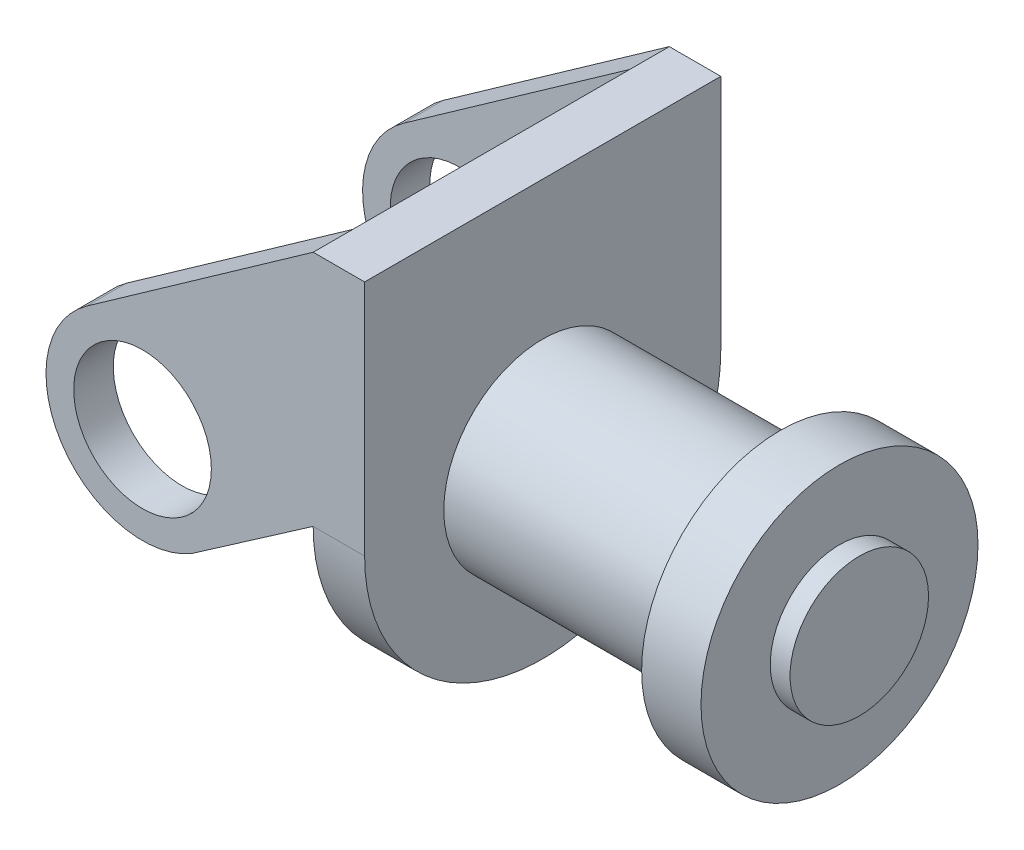
ISO-10303-21;
HEADER;
FILE_DESCRIPTION(('STEP AP214'),'2;1');
FILE_NAME('part.step','',(''),(''),'','','');
FILE_SCHEMA(('AUTOMOTIVE_DESIGN { 1 0 10303 214 1 1 1 1 }'));
ENDSEC;
DATA;
#1=APPLICATION_CONTEXT('core data for automotive mechanical design processes');
#2=APPLICATION_PROTOCOL_DEFINITION('international standard','automotive_design',2000,#1);
#3=PRODUCT_CONTEXT('',#1,'mechanical');
#4=PRODUCT('Part','Part','',(#3));
#5=PRODUCT_RELATED_PRODUCT_CATEGORY('part','',(#4));
#6=PRODUCT_DEFINITION_FORMATION('','',#4);
#7=PRODUCT_DEFINITION_CONTEXT('part definition',#1,'design');
#8=PRODUCT_DEFINITION('design','',#6,#7);
#9=PRODUCT_DEFINITION_SHAPE('','',#8);
#10=(LENGTH_UNIT() NAMED_UNIT(*) SI_UNIT(.MILLI.,.METRE.));
#11=(NAMED_UNIT(*) PLANE_ANGLE_UNIT() SI_UNIT($,.RADIAN.));
#12=(NAMED_UNIT(*) SI_UNIT($,.STERADIAN.) SOLID_ANGLE_UNIT());
#13=UNCERTAINTY_MEASURE_WITH_UNIT(LENGTH_MEASURE(1.E-05),#10,'distance_accuracy_value','');
#14=(GEOMETRIC_REPRESENTATION_CONTEXT(3) GLOBAL_UNCERTAINTY_ASSIGNED_CONTEXT((#13)) GLOBAL_UNIT_ASSIGNED_CONTEXT((#10,
#11,#12)) REPRESENTATION_CONTEXT('',''));
#15=CARTESIAN_POINT('',(0.,0.,0.));
#16=DIRECTION('',(0.,0.,1.));
#17=DIRECTION('',(1.,0.,0.));
#18=AXIS2_PLACEMENT_3D('',#15,#16,#17);
#19=CARTESIAN_POINT('',(0.,-0.06,0.));
#20=DIRECTION('',(1.,0.,0.));
#21=DIRECTION('',(0.,0.,-1.));
#22=AXIS2_PLACEMENT_3D('',#19,#20,#21);
#23=PLANE('',#22);
#24=DIRECTION('',(0.,0.,1.));
#25=VECTOR('',#24,1.);
#26=CARTESIAN_POINT('',(0.,-0.06,0.035));
#27=LINE('',#26,#25);
#28=CARTESIAN_POINT('',(0.,-0.06,0.035));
#29=VERTEX_POINT('',#28);
#30=CARTESIAN_POINT('',(0.,-0.06,0.045));
#31=VERTEX_POINT('',#30);
#32=EDGE_CURVE('E153',#29,#31,#27,.T.);
#33=ORIENTED_EDGE('',*,*,#32,.F.);
#34=DIRECTION('',(0.,1.,0.));
#35=VECTOR('',#34,1.);
#36=CARTESIAN_POINT('',(0.,-0.06,0.035));
#37=LINE('',#36,#35);
#38=CARTESIAN_POINT('',(0.,0.,0.035));
#39=VERTEX_POINT('',#38);
#40=EDGE_CURVE('E11',#29,#39,#37,.T.);
#41=ORIENTED_EDGE('',*,*,#40,.T.);
#42=DIRECTION('',(0.,0.,-1.));
#43=VECTOR('',#42,1.);
#44=CARTESIAN_POINT('',(0.,0.,0.045));
#45=LINE('',#44,#43);
#46=CARTESIAN_POINT('',(0.,0.,-0.035));
#47=VERTEX_POINT('',#46);
#48=EDGE_CURVE('E215',#39,#47,#45,.T.);
#49=ORIENTED_EDGE('',*,*,#48,.T.);
#50=DIRECTION('',(0.,-1.,0.));
#51=VECTOR('',#50,1.);
#52=CARTESIAN_POINT('',(0.,-0.06,-0.035));
#53=LINE('',#52,#51);
#54=CARTESIAN_POINT('',(0.,-0.06,-0.035));
#55=VERTEX_POINT('',#54);
#56=EDGE_CURVE('E55',#47,#55,#53,.T.);
#57=ORIENTED_EDGE('',*,*,#56,.T.);
#58=DIRECTION('',(0.,0.,-1.));
#59=VECTOR('',#58,1.);
#60=CARTESIAN_POINT('',(0.,-0.06,-0.035));
#61=LINE('',#60,#59);
#62=CARTESIAN_POINT('',(0.,-0.06,-0.045));
#63=VERTEX_POINT('',#62);
#64=EDGE_CURVE('E164',#55,#63,#61,.T.);
#65=ORIENTED_EDGE('',*,*,#64,.T.);
#66=CARTESIAN_POINT('',(0.,-0.06,0.));
#67=DIRECTION('',(1.,0.,0.));
#68=DIRECTION('',(0.,0.,-1.));
#69=AXIS2_PLACEMENT_3D('',#66,#67,#68);
#70=CIRCLE('',#69,0.045);
#71=EDGE_CURVE('E194',#31,#63,#70,.T.);
#72=ORIENTED_EDGE('',*,*,#71,.F.);
#73=EDGE_LOOP('',(#33,#41,#49,#57,#65,#72));
#74=FACE_BOUND('',#73,.T.);
#75=ADVANCED_FACE('F43',(#74),#23,.F.);
#76=CARTESIAN_POINT('',(0.088,-0.06,0.));
#77=DIRECTION('',(-1.,0.,0.));
#78=DIRECTION('',(0.,0.,1.));
#79=AXIS2_PLACEMENT_3D('',#76,#77,#78);
#80=CYLINDRICAL_SURFACE('',#79,0.025);
#81=CARTESIAN_POINT('',(0.013,-0.06,0.));
#82=DIRECTION('',(1.,0.,0.));
#83=DIRECTION('',(0.,0.,-1.));
#84=AXIS2_PLACEMENT_3D('',#81,#82,#83);
#85=CIRCLE('',#84,0.025);
#86=CARTESIAN_POINT('',(0.013,-0.06,-0.025));
#87=VERTEX_POINT('',#86);
#88=EDGE_CURVE('E191',#87,#87,#85,.T.);
#89=ORIENTED_EDGE('',*,*,#88,.T.);
#90=EDGE_LOOP('',(#89));
#91=FACE_BOUND('',#90,.T.);
#92=CARTESIAN_POINT('',(0.073,-0.06,0.));
#93=DIRECTION('',(1.,0.,0.));
#94=DIRECTION('',(0.,0.,-1.));
#95=AXIS2_PLACEMENT_3D('',#92,#93,#94);
#96=CIRCLE('',#95,0.025);
#97=CARTESIAN_POINT('',(0.073,-0.06,-0.025));
#98=VERTEX_POINT('',#97);
#99=EDGE_CURVE('E187',#98,#98,#96,.T.);
#100=ORIENTED_EDGE('',*,*,#99,.F.);
#101=EDGE_LOOP('',(#100));
#102=FACE_BOUND('',#101,.T.);
#103=ADVANCED_FACE('F266',(#91,#102),#80,.T.);
#104=CARTESIAN_POINT('',(0.013,0.,0.045));
#105=DIRECTION('',(0.,0.,-1.));
#106=DIRECTION('',(0.,1.,0.));
#107=AXIS2_PLACEMENT_3D('',#104,#105,#106);
#108=PLANE('',#107);
#109=CARTESIAN_POINT('',(-0.0431220403973092,-0.0602956681829151,0.045));
#110=DIRECTION('',(0.,0.,1.));
#111=DIRECTION('',(1.,0.,0.));
#112=AXIS2_PLACEMENT_3D('',#109,#110,#111);
#113=CIRCLE('',#112,0.0173942200049799);
#114=CARTESIAN_POINT('',(-0.0257278203923293,-0.0602956681829151,0.045));
#115=VERTEX_POINT('',#114);
#116=EDGE_CURVE('E286',#115,#115,#113,.T.);
#117=ORIENTED_EDGE('',*,*,#116,.F.);
#118=EDGE_LOOP('',(#117));
#119=FACE_BOUND('',#118,.T.);
#120=DIRECTION('',(-1.,0.,0.));
#121=VECTOR('',#120,1.);
#122=CARTESIAN_POINT('',(0.013,0.,0.045));
#123=LINE('',#122,#121);
#124=CARTESIAN_POINT('',(0.013,0.,0.045));
#125=VERTEX_POINT('',#124);
#126=CARTESIAN_POINT('',(0.,0.,0.045));
#127=VERTEX_POINT('',#126);
#128=EDGE_CURVE('E207',#125,#127,#123,.T.);
#129=ORIENTED_EDGE('',*,*,#128,.T.);
#130=DIRECTION('',(0.816987247061351,0.576655736240537,0.));
#131=VECTOR('',#130,1.);
#132=CARTESIAN_POINT('',(0.,0.,0.045));
#133=LINE('',#132,#131);
#134=CARTESIAN_POINT('',(-0.0571891072942945,-0.0403659015368376,0.045));
#135=VERTEX_POINT('',#134);
#136=EDGE_CURVE('E147',#135,#127,#133,.T.);
#137=ORIENTED_EDGE('',*,*,#136,.F.);
#138=CARTESIAN_POINT('',(-0.0431220403973092,-0.060295668182915,0.045));
#139=DIRECTION('',(0.,0.,-1.));
#140=DIRECTION('',(0.,-1.,0.));
#141=AXIS2_PLACEMENT_3D('',#138,#139,#140);
#142=CIRCLE('',#141,0.0243942200049799);
#143=CARTESIAN_POINT('',(-0.0307207334949169,-0.0813024660532245,0.045));
#144=VERTEX_POINT('',#143);
#145=EDGE_CURVE('E139',#144,#135,#142,.T.);
#146=ORIENTED_EDGE('',*,*,#145,.F.);
#147=DIRECTION('',(-0.821762991526895,-0.569829435670682,0.));
#148=VECTOR('',#147,1.);
#149=CARTESIAN_POINT('',(0.,-0.06,0.045));
#150=LINE('',#149,#148);
#151=EDGE_CURVE('E142',#31,#144,#150,.T.);
#152=ORIENTED_EDGE('',*,*,#151,.F.);
#153=DIRECTION('',(-1.,0.,0.));
#154=VECTOR('',#153,1.);
#155=CARTESIAN_POINT('',(0.013,-0.06,0.045));
#156=LINE('',#155,#154);
#157=CARTESIAN_POINT('',(0.013,-0.06,0.045));
#158=VERTEX_POINT('',#157);
#159=EDGE_CURVE('E196',#158,#31,#156,.T.);
#160=ORIENTED_EDGE('',*,*,#159,.F.);
#161=DIRECTION('',(0.,-1.,0.));
#162=VECTOR('',#161,1.);
#163=CARTESIAN_POINT('',(0.013,0.,0.045));
#164=LINE('',#163,#162);
#165=EDGE_CURVE('E200',#125,#158,#164,.T.);
#166=ORIENTED_EDGE('',*,*,#165,.F.);
#167=EDGE_LOOP('',(#129,#137,#146,#152,#160,#166));
#168=FACE_BOUND('',#167,.T.);
#169=ADVANCED_FACE('F44',(#119,#168),#108,.F.);
#170=CARTESIAN_POINT('',(0.013,-0.06,0.));
#171=DIRECTION('',(-1.,0.,0.));
#172=DIRECTION('',(0.,0.,1.));
#173=AXIS2_PLACEMENT_3D('',#170,#171,#172);
#174=CYLINDRICAL_SURFACE('',#173,0.045);
#175=ORIENTED_EDGE('',*,*,#71,.T.);
#176=DIRECTION('',(-1.,0.,0.));
#177=VECTOR('',#176,1.);
#178=CARTESIAN_POINT('',(0.013,-0.06,-0.045));
#179=LINE('',#178,#177);
#180=CARTESIAN_POINT('',(0.013,-0.06,-0.045));
#181=VERTEX_POINT('',#180);
#182=EDGE_CURVE('E218',#181,#63,#179,.T.);
#183=ORIENTED_EDGE('',*,*,#182,.F.);
#184=CARTESIAN_POINT('',(0.013,-0.06,0.));
#185=DIRECTION('',(1.,0.,0.));
#186=DIRECTION('',(0.,0.,-1.));
#187=AXIS2_PLACEMENT_3D('',#184,#185,#186);
#188=CIRCLE('',#187,0.045);
#189=EDGE_CURVE('E205',#158,#181,#188,.T.);
#190=ORIENTED_EDGE('',*,*,#189,.F.);
#191=ORIENTED_EDGE('',*,*,#159,.T.);
#192=EDGE_LOOP('',(#175,#183,#190,#191));
#193=FACE_BOUND('',#192,.T.);
#194=ADVANCED_FACE('F253',(#193),#174,.T.);
#195=CARTESIAN_POINT('',(0.013,0.,-0.045));
#196=DIRECTION('',(0.,0.,-1.));
#197=DIRECTION('',(0.,1.,0.));
#198=AXIS2_PLACEMENT_3D('',#195,#196,#197);
#199=PLANE('',#198);
#200=CARTESIAN_POINT('',(-0.0431220403973092,-0.0602956681829151,-0.045));
#201=DIRECTION('',(0.,0.,1.));
#202=DIRECTION('',(1.,0.,0.));
#203=AXIS2_PLACEMENT_3D('',#200,#201,#202);
#204=CIRCLE('',#203,0.0173942200049799);
#205=CARTESIAN_POINT('',(-0.0257278203923293,-0.0602956681829151,-0.045));
#206=VERTEX_POINT('',#205);
#207=EDGE_CURVE('E321',#206,#206,#204,.T.);
#208=ORIENTED_EDGE('',*,*,#207,.T.);
#209=EDGE_LOOP('',(#208));
#210=FACE_BOUND('',#209,.T.);
#211=ORIENTED_EDGE('',*,*,#182,.T.);
#212=DIRECTION('',(-0.821762991526895,-0.569829435670682,0.));
#213=VECTOR('',#212,1.);
#214=CARTESIAN_POINT('',(0.,-0.06,-0.045));
#215=LINE('',#214,#213);
#216=CARTESIAN_POINT('',(-0.0307207334949169,-0.0813024660532245,-0.045));
#217=VERTEX_POINT('',#216);
#218=EDGE_CURVE('E154',#63,#217,#215,.T.);
#219=ORIENTED_EDGE('',*,*,#218,.T.);
#220=CARTESIAN_POINT('',(-0.0431220403973092,-0.060295668182915,-0.045));
#221=DIRECTION('',(0.,0.,-1.));
#222=DIRECTION('',(0.,-1.,0.));
#223=AXIS2_PLACEMENT_3D('',#220,#221,#222);
#224=CIRCLE('',#223,0.0243942200049799);
#225=CARTESIAN_POINT('',(-0.0571891072942945,-0.0403659015368376,-0.045));
#226=VERTEX_POINT('',#225);
#227=EDGE_CURVE('E169',#217,#226,#224,.T.);
#228=ORIENTED_EDGE('',*,*,#227,.T.);
#229=DIRECTION('',(0.816987247061351,0.576655736240537,0.));
#230=VECTOR('',#229,1.);
#231=CARTESIAN_POINT('',(0.,0.,-0.045));
#232=LINE('',#231,#230);
#233=CARTESIAN_POINT('',(0.,0.,-0.045));
#234=VERTEX_POINT('',#233);
#235=EDGE_CURVE('E157',#226,#234,#232,.T.);
#236=ORIENTED_EDGE('',*,*,#235,.T.);
#237=DIRECTION('',(-1.,0.,0.));
#238=VECTOR('',#237,1.);
#239=CARTESIAN_POINT('',(0.013,0.,-0.045));
#240=LINE('',#239,#238);
#241=CARTESIAN_POINT('',(0.013,0.,-0.045));
#242=VERTEX_POINT('',#241);
#243=EDGE_CURVE('E216',#242,#234,#240,.T.);
#244=ORIENTED_EDGE('',*,*,#243,.F.);
#245=DIRECTION('',(0.,-1.,0.));
#246=VECTOR('',#245,1.);
#247=CARTESIAN_POINT('',(0.013,0.,-0.045));
#248=LINE('',#247,#246);
#249=EDGE_CURVE('E204',#242,#181,#248,.T.);
#250=ORIENTED_EDGE('',*,*,#249,.T.);
#251=EDGE_LOOP('',(#211,#219,#228,#236,#244,#250));
#252=FACE_BOUND('',#251,.T.);
#253=ADVANCED_FACE('F242',(#210,#252),#199,.T.);
#254=CARTESIAN_POINT('',(0.013,0.,0.045));
#255=DIRECTION('',(0.,1.,0.));
#256=DIRECTION('',(0.,0.,1.));
#257=AXIS2_PLACEMENT_3D('',#254,#255,#256);
#258=PLANE('',#257);
#259=DIRECTION('',(0.,0.,-1.));
#260=VECTOR('',#259,1.);
#261=CARTESIAN_POINT('',(0.013,0.,0.045));
#262=LINE('',#261,#260);
#263=EDGE_CURVE('E210',#125,#242,#262,.T.);
#264=ORIENTED_EDGE('',*,*,#263,.T.);
#265=ORIENTED_EDGE('',*,*,#243,.T.);
#266=DIRECTION('',(0.,0.,-1.));
#267=VECTOR('',#266,1.);
#268=CARTESIAN_POINT('',(0.,0.,-0.035));
#269=LINE('',#268,#267);
#270=EDGE_CURVE('E172',#47,#234,#269,.T.);
#271=ORIENTED_EDGE('',*,*,#270,.F.);
#272=ORIENTED_EDGE('',*,*,#48,.F.);
#273=EDGE_CURVE('E56',#127,#39,#45,.T.);
#274=ORIENTED_EDGE('',*,*,#273,.F.);
#275=ORIENTED_EDGE('',*,*,#128,.F.);
#276=EDGE_LOOP('',(#264,#265,#271,#272,#274,#275));
#277=FACE_BOUND('',#276,.T.);
#278=ADVANCED_FACE('F236',(#277),#258,.T.);
#279=CARTESIAN_POINT('',(0.013,-0.06,0.));
#280=DIRECTION('',(1.,0.,0.));
#281=DIRECTION('',(0.,0.,-1.));
#282=AXIS2_PLACEMENT_3D('',#279,#280,#281);
#283=PLANE('',#282);
#284=ORIENTED_EDGE('',*,*,#165,.T.);
#285=ORIENTED_EDGE('',*,*,#189,.T.);
#286=ORIENTED_EDGE('',*,*,#249,.F.);
#287=ORIENTED_EDGE('',*,*,#263,.F.);
#288=EDGE_LOOP('',(#284,#285,#286,#287));
#289=FACE_BOUND('',#288,.T.);
#290=ORIENTED_EDGE('',*,*,#88,.F.);
#291=EDGE_LOOP('',(#290));
#292=FACE_BOUND('',#291,.T.);
#293=ADVANCED_FACE('F244',(#289,#292),#283,.T.);
#294=CARTESIAN_POINT('',(0.186994949366117,-0.06,0.));
#295=DIRECTION('',(-1.,0.,0.));
#296=DIRECTION('',(0.,0.,1.));
#297=AXIS2_PLACEMENT_3D('',#294,#295,#296);
#298=CYLINDRICAL_SURFACE('',#297,0.035);
#299=CARTESIAN_POINT('',(0.073,-0.06,0.));
#300=DIRECTION('',(1.,0.,0.));
#301=DIRECTION('',(0.,0.,-1.));
#302=AXIS2_PLACEMENT_3D('',#299,#300,#301);
#303=CIRCLE('',#302,0.035);
#304=CARTESIAN_POINT('',(0.073,-0.06,-0.035));
#305=VERTEX_POINT('',#304);
#306=EDGE_CURVE('E184',#305,#305,#303,.T.);
#307=ORIENTED_EDGE('',*,*,#306,.T.);
#308=EDGE_LOOP('',(#307));
#309=FACE_BOUND('',#308,.T.);
#310=CARTESIAN_POINT('',(0.088,-0.06,0.));
#311=DIRECTION('',(1.,0.,0.));
#312=DIRECTION('',(0.,0.,-1.));
#313=AXIS2_PLACEMENT_3D('',#310,#311,#312);
#314=CIRCLE('',#313,0.035);
#315=CARTESIAN_POINT('',(0.088,-0.06,-0.035));
#316=VERTEX_POINT('',#315);
#317=EDGE_CURVE('E188',#316,#316,#314,.T.);
#318=ORIENTED_EDGE('',*,*,#317,.F.);
#319=EDGE_LOOP('',(#318));
#320=FACE_BOUND('',#319,.T.);
#321=ADVANCED_FACE('F442',(#309,#320),#298,.T.);
#322=CARTESIAN_POINT('',(0.073,-0.06,0.));
#323=DIRECTION('',(1.,0.,0.));
#324=DIRECTION('',(0.,0.,-1.));
#325=AXIS2_PLACEMENT_3D('',#322,#323,#324);
#326=PLANE('',#325);
#327=ORIENTED_EDGE('',*,*,#306,.F.);
#328=EDGE_LOOP('',(#327));
#329=FACE_BOUND('',#328,.T.);
#330=ORIENTED_EDGE('',*,*,#99,.T.);
#331=EDGE_LOOP('',(#330));
#332=FACE_BOUND('',#331,.T.);
#333=ADVANCED_FACE('F428',(#329,#332),#326,.F.);
#334=CARTESIAN_POINT('',(0.088,-0.06,0.));
#335=DIRECTION('',(1.,0.,0.));
#336=DIRECTION('',(0.,0.,-1.));
#337=AXIS2_PLACEMENT_3D('',#334,#335,#336);
#338=PLANE('',#337);
#339=CARTESIAN_POINT('',(0.088,-0.06,0.));
#340=DIRECTION('',(1.,0.,0.));
#341=DIRECTION('',(0.,0.,-1.));
#342=AXIS2_PLACEMENT_3D('',#339,#340,#341);
#343=CIRCLE('',#342,0.0175);
#344=CARTESIAN_POINT('',(0.088,-0.06,-0.0175));
#345=VERTEX_POINT('',#344);
#346=EDGE_CURVE('E183',#345,#345,#343,.T.);
#347=ORIENTED_EDGE('',*,*,#346,.F.);
#348=EDGE_LOOP('',(#347));
#349=FACE_BOUND('',#348,.T.);
#350=ORIENTED_EDGE('',*,*,#317,.T.);
#351=EDGE_LOOP('',(#350));
#352=FACE_BOUND('',#351,.T.);
#353=ADVANCED_FACE('F417',(#349,#352),#338,.T.);
#354=CARTESIAN_POINT('',(0.093,-0.06,0.));
#355=DIRECTION('',(-1.,0.,0.));
#356=DIRECTION('',(0.,0.,1.));
#357=AXIS2_PLACEMENT_3D('',#354,#355,#356);
#358=CYLINDRICAL_SURFACE('',#357,0.0175);
#359=CARTESIAN_POINT('',(0.093,-0.06,0.));
#360=DIRECTION('',(1.,0.,0.));
#361=DIRECTION('',(0.,0.,-1.));
#362=AXIS2_PLACEMENT_3D('',#359,#360,#361);
#363=CIRCLE('',#362,0.0175);
#364=CARTESIAN_POINT('',(0.093,-0.06,-0.0175));
#365=VERTEX_POINT('',#364);
#366=EDGE_CURVE('E174',#365,#365,#363,.T.);
#367=ORIENTED_EDGE('',*,*,#366,.F.);
#368=EDGE_LOOP('',(#367));
#369=FACE_BOUND('',#368,.T.);
#370=ORIENTED_EDGE('',*,*,#346,.T.);
#371=EDGE_LOOP('',(#370));
#372=FACE_BOUND('',#371,.T.);
#373=ADVANCED_FACE('F314',(#369,#372),#358,.T.);
#374=CARTESIAN_POINT('',(0.093,-0.06,0.));
#375=DIRECTION('',(1.,0.,0.));
#376=DIRECTION('',(0.,0.,-1.));
#377=AXIS2_PLACEMENT_3D('',#374,#375,#376);
#378=PLANE('',#377);
#379=ORIENTED_EDGE('',*,*,#366,.T.);
#380=EDGE_LOOP('',(#379));
#381=FACE_BOUND('',#380,.T.);
#382=ADVANCED_FACE('F310',(#381),#378,.T.);
#383=CARTESIAN_POINT('',(-0.0431220403973092,-0.0602956681829151,-0.035));
#384=DIRECTION('',(0.,0.,1.));
#385=DIRECTION('',(0.,-1.,0.));
#386=AXIS2_PLACEMENT_3D('',#383,#384,#385);
#387=PLANE('',#386);
#388=CARTESIAN_POINT('',(-0.0431220403973092,-0.0602956681829151,-0.035));
#389=DIRECTION('',(0.,0.,1.));
#390=DIRECTION('',(0.,-1.,0.));
#391=AXIS2_PLACEMENT_3D('',#388,#389,#390);
#392=CIRCLE('',#391,0.0173942200049799);
#393=CARTESIAN_POINT('',(-0.0431220403973092,-0.077689888187895,-0.035));
#394=VERTEX_POINT('',#393);
#395=EDGE_CURVE('E148',#394,#394,#392,.T.);
#396=ORIENTED_EDGE('',*,*,#395,.F.);
#397=EDGE_LOOP('',(#396));
#398=FACE_BOUND('',#397,.T.);
#399=ORIENTED_EDGE('',*,*,#56,.F.);
#400=DIRECTION('',(0.816987247061351,0.576655736240537,0.));
#401=VECTOR('',#400,1.);
#402=CARTESIAN_POINT('',(0.,0.,-0.035));
#403=LINE('',#402,#401);
#404=CARTESIAN_POINT('',(-0.0571891072942945,-0.0403659015368376,-0.035));
#405=VERTEX_POINT('',#404);
#406=EDGE_CURVE('E165',#405,#47,#403,.T.);
#407=ORIENTED_EDGE('',*,*,#406,.F.);
#408=CARTESIAN_POINT('',(-0.0431220403973092,-0.0602956681829151,-0.035));
#409=DIRECTION('',(0.,0.,-1.));
#410=DIRECTION('',(0.,-1.,0.));
#411=AXIS2_PLACEMENT_3D('',#408,#409,#410);
#412=CIRCLE('',#411,0.0243942200049799);
#413=CARTESIAN_POINT('',(-0.0307207334949169,-0.0813024660532245,-0.035));
#414=VERTEX_POINT('',#413);
#415=EDGE_CURVE('E158',#414,#405,#412,.T.);
#416=ORIENTED_EDGE('',*,*,#415,.F.);
#417=DIRECTION('',(-0.821762991526895,-0.569829435670682,0.));
#418=VECTOR('',#417,1.);
#419=CARTESIAN_POINT('',(0.,-0.06,-0.035));
#420=LINE('',#419,#418);
#421=EDGE_CURVE('E69',#55,#414,#420,.T.);
#422=ORIENTED_EDGE('',*,*,#421,.F.);
#423=EDGE_LOOP('',(#399,#407,#416,#422));
#424=FACE_BOUND('',#423,.T.);
#425=ADVANCED_FACE('F234',(#398,#424),#387,.T.);
#426=CARTESIAN_POINT('',(0.,0.,-0.035));
#427=DIRECTION('',(-0.576655736240537,0.816987247061351,0.));
#428=DIRECTION('',(-0.816987247061351,-0.576655736240537,0.));
#429=AXIS2_PLACEMENT_3D('',#426,#427,#428);
#430=PLANE('',#429);
#431=ORIENTED_EDGE('',*,*,#235,.F.);
#432=DIRECTION('',(0.,0.,-1.));
#433=VECTOR('',#432,1.);
#434=CARTESIAN_POINT('',(-0.0571891072942945,-0.0403659015368376,-0.035));
#435=LINE('',#434,#433);
#436=EDGE_CURVE('E178',#405,#226,#435,.T.);
#437=ORIENTED_EDGE('',*,*,#436,.F.);
#438=ORIENTED_EDGE('',*,*,#406,.T.);
#439=ORIENTED_EDGE('',*,*,#270,.T.);
#440=EDGE_LOOP('',(#431,#437,#438,#439));
#441=FACE_BOUND('',#440,.T.);
#442=ADVANCED_FACE('F237',(#441),#430,.T.);
#443=CARTESIAN_POINT('',(-0.0431220403973092,-0.0602956681829151,-0.035));
#444=DIRECTION('',(0.,0.,-1.));
#445=DIRECTION('',(0.,1.,0.));
#446=AXIS2_PLACEMENT_3D('',#443,#444,#445);
#447=CYLINDRICAL_SURFACE('',#446,0.0243942200049799);
#448=ORIENTED_EDGE('',*,*,#227,.F.);
#449=DIRECTION('',(0.,0.,-1.));
#450=VECTOR('',#449,1.);
#451=CARTESIAN_POINT('',(-0.0307207334949169,-0.0813024660532245,-0.035));
#452=LINE('',#451,#450);
#453=EDGE_CURVE('E177',#414,#217,#452,.T.);
#454=ORIENTED_EDGE('',*,*,#453,.F.);
#455=ORIENTED_EDGE('',*,*,#415,.T.);
#456=ORIENTED_EDGE('',*,*,#436,.T.);
#457=EDGE_LOOP('',(#448,#454,#455,#456));
#458=FACE_BOUND('',#457,.T.);
#459=ADVANCED_FACE('F258',(#458),#447,.T.);
#460=CARTESIAN_POINT('',(0.,-0.06,-0.035));
#461=DIRECTION('',(0.569829435670682,-0.821762991526895,0.));
#462=DIRECTION('',(0.821762991526895,0.569829435670682,0.));
#463=AXIS2_PLACEMENT_3D('',#460,#461,#462);
#464=PLANE('',#463);
#465=ORIENTED_EDGE('',*,*,#218,.F.);
#466=ORIENTED_EDGE('',*,*,#64,.F.);
#467=ORIENTED_EDGE('',*,*,#421,.T.);
#468=ORIENTED_EDGE('',*,*,#453,.T.);
#469=EDGE_LOOP('',(#465,#466,#467,#468));
#470=FACE_BOUND('',#469,.T.);
#471=ADVANCED_FACE('F255',(#470),#464,.T.);
#472=CARTESIAN_POINT('',(-0.0431220403973092,-0.0602956681829151,0.035));
#473=DIRECTION('',(0.,0.,-1.));
#474=DIRECTION('',(0.,-1.,0.));
#475=AXIS2_PLACEMENT_3D('',#472,#473,#474);
#476=PLANE('',#475);
#477=CARTESIAN_POINT('',(-0.0431220403973092,-0.0602956681829151,0.035));
#478=DIRECTION('',(0.,0.,-1.));
#479=DIRECTION('',(0.,1.,0.));
#480=AXIS2_PLACEMENT_3D('',#477,#478,#479);
#481=CIRCLE('',#480,0.0173942200049799);
#482=CARTESIAN_POINT('',(-0.0431220403973092,-0.0429014481779351,0.035));
#483=VERTEX_POINT('',#482);
#484=EDGE_CURVE('E50',#483,#483,#481,.T.);
#485=ORIENTED_EDGE('',*,*,#484,.F.);
#486=EDGE_LOOP('',(#485));
#487=FACE_BOUND('',#486,.T.);
#488=ORIENTED_EDGE('',*,*,#40,.F.);
#489=DIRECTION('',(-0.821762991526895,-0.569829435670682,0.));
#490=VECTOR('',#489,1.);
#491=CARTESIAN_POINT('',(0.,-0.06,0.035));
#492=LINE('',#491,#490);
#493=CARTESIAN_POINT('',(-0.0307207334949169,-0.0813024660532245,0.035));
#494=VERTEX_POINT('',#493);
#495=EDGE_CURVE('E126',#29,#494,#492,.T.);
#496=ORIENTED_EDGE('',*,*,#495,.T.);
#497=CARTESIAN_POINT('',(-0.0431220403973092,-0.0602956681829151,0.035));
#498=DIRECTION('',(0.,0.,-1.));
#499=DIRECTION('',(0.,-1.,0.));
#500=AXIS2_PLACEMENT_3D('',#497,#498,#499);
#501=CIRCLE('',#500,0.0243942200049799);
#502=CARTESIAN_POINT('',(-0.0571891072942945,-0.0403659015368376,0.035));
#503=VERTEX_POINT('',#502);
#504=EDGE_CURVE('E122',#494,#503,#501,.T.);
#505=ORIENTED_EDGE('',*,*,#504,.T.);
#506=DIRECTION('',(0.816987247061351,0.576655736240537,0.));
#507=VECTOR('',#506,1.);
#508=CARTESIAN_POINT('',(0.,0.,0.035));
#509=LINE('',#508,#507);
#510=EDGE_CURVE('E127',#503,#39,#509,.T.);
#511=ORIENTED_EDGE('',*,*,#510,.T.);
#512=EDGE_LOOP('',(#488,#496,#505,#511));
#513=FACE_BOUND('',#512,.T.);
#514=ADVANCED_FACE('F121',(#487,#513),#476,.T.);
#515=CARTESIAN_POINT('',(0.,-0.06,0.035));
#516=DIRECTION('',(-0.569829435670682,0.821762991526895,0.));
#517=DIRECTION('',(-0.821762991526895,-0.569829435670682,0.));
#518=AXIS2_PLACEMENT_3D('',#515,#516,#517);
#519=PLANE('',#518);
#520=ORIENTED_EDGE('',*,*,#151,.T.);
#521=DIRECTION('',(0.,0.,1.));
#522=VECTOR('',#521,1.);
#523=CARTESIAN_POINT('',(-0.0307207334949169,-0.0813024660532245,0.035));
#524=LINE('',#523,#522);
#525=EDGE_CURVE('E140',#494,#144,#524,.T.);
#526=ORIENTED_EDGE('',*,*,#525,.F.);
#527=ORIENTED_EDGE('',*,*,#495,.F.);
#528=ORIENTED_EDGE('',*,*,#32,.T.);
#529=EDGE_LOOP('',(#520,#526,#527,#528));
#530=FACE_BOUND('',#529,.T.);
#531=ADVANCED_FACE('F291',(#530),#519,.F.);
#532=CARTESIAN_POINT('',(-0.0431220403973092,-0.0602956681829151,0.035));
#533=DIRECTION('',(0.,0.,1.));
#534=DIRECTION('',(0.,-1.,0.));
#535=AXIS2_PLACEMENT_3D('',#532,#533,#534);
#536=CYLINDRICAL_SURFACE('',#535,0.0243942200049799);
#537=ORIENTED_EDGE('',*,*,#145,.T.);
#538=DIRECTION('',(0.,0.,1.));
#539=VECTOR('',#538,1.);
#540=CARTESIAN_POINT('',(-0.0571891072942945,-0.0403659015368376,0.035));
#541=LINE('',#540,#539);
#542=EDGE_CURVE('E133',#503,#135,#541,.T.);
#543=ORIENTED_EDGE('',*,*,#542,.F.);
#544=ORIENTED_EDGE('',*,*,#504,.F.);
#545=ORIENTED_EDGE('',*,*,#525,.T.);
#546=EDGE_LOOP('',(#537,#543,#544,#545));
#547=FACE_BOUND('',#546,.T.);
#548=ADVANCED_FACE('F134',(#547),#536,.T.);
#549=CARTESIAN_POINT('',(0.,0.,0.035));
#550=DIRECTION('',(0.576655736240537,-0.816987247061351,0.));
#551=DIRECTION('',(0.816987247061351,0.576655736240537,0.));
#552=AXIS2_PLACEMENT_3D('',#549,#550,#551);
#553=PLANE('',#552);
#554=ORIENTED_EDGE('',*,*,#136,.T.);
#555=ORIENTED_EDGE('',*,*,#273,.T.);
#556=ORIENTED_EDGE('',*,*,#510,.F.);
#557=ORIENTED_EDGE('',*,*,#542,.T.);
#558=EDGE_LOOP('',(#554,#555,#556,#557));
#559=FACE_BOUND('',#558,.T.);
#560=ADVANCED_FACE('F143',(#559),#553,.F.);
#561=CARTESIAN_POINT('',(-0.0431220403973092,-0.0602956681829151,-0.045));
#562=DIRECTION('',(0.,0.,1.));
#563=DIRECTION('',(1.,0.,0.));
#564=AXIS2_PLACEMENT_3D('',#561,#562,#563);
#565=CYLINDRICAL_SURFACE('',#564,0.0173942200049799);
#566=ORIENTED_EDGE('',*,*,#484,.T.);
#567=EDGE_LOOP('',(#566));
#568=FACE_BOUND('',#567,.T.);
#569=ORIENTED_EDGE('',*,*,#116,.T.);
#570=EDGE_LOOP('',(#569));
#571=FACE_BOUND('',#570,.T.);
#572=ADVANCED_FACE('F307',(#568,#571),#565,.F.);
#573=ORIENTED_EDGE('',*,*,#395,.T.);
#574=EDGE_LOOP('',(#573));
#575=FACE_BOUND('',#574,.T.);
#576=ORIENTED_EDGE('',*,*,#207,.F.);
#577=EDGE_LOOP('',(#576));
#578=FACE_BOUND('',#577,.T.);
#579=ADVANCED_FACE('F328',(#575,#578),#565,.F.);
#580=CLOSED_SHELL('',(#75,#103,#169,#194,#253,#278,#293,#321,#333,#353,#373,#382,#425,#442,#459,
#471,#514,#531,#548,#560,#572,#579));
#581=MANIFOLD_SOLID_BREP('B2',#580);
#582=ADVANCED_BREP_SHAPE_REPRESENTATION('',(#18,#581),#14);
#583=SHAPE_DEFINITION_REPRESENTATION(#9,#582);
ENDSEC;
END-ISO-10303-21;
